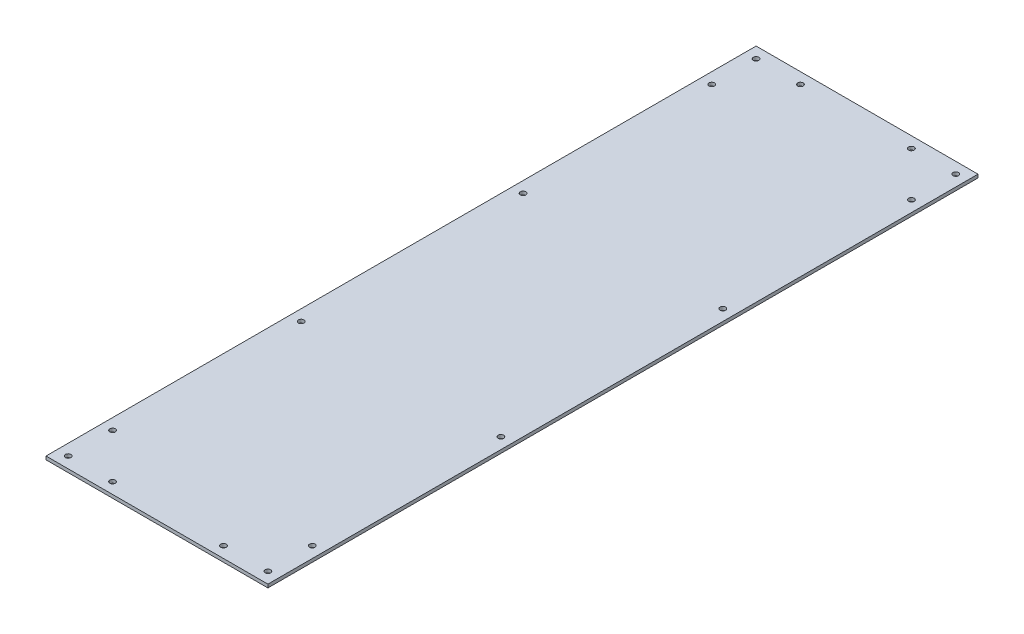
ISO-10303-21;
HEADER;
FILE_DESCRIPTION(('STEP AP214'),'2;1');
FILE_NAME('part.step','',(''),(''),'','','');
FILE_SCHEMA(('AUTOMOTIVE_DESIGN { 1 0 10303 214 1 1 1 1 }'));
ENDSEC;
DATA;
#1=APPLICATION_CONTEXT('core data for automotive mechanical design processes');
#2=APPLICATION_PROTOCOL_DEFINITION('international standard','automotive_design',2000,#1);
#3=PRODUCT_CONTEXT('',#1,'mechanical');
#4=PRODUCT('Part','Part','',(#3));
#5=PRODUCT_RELATED_PRODUCT_CATEGORY('part','',(#4));
#6=PRODUCT_DEFINITION_FORMATION('','',#4);
#7=PRODUCT_DEFINITION_CONTEXT('part definition',#1,'design');
#8=PRODUCT_DEFINITION('design','',#6,#7);
#9=PRODUCT_DEFINITION_SHAPE('','',#8);
#10=(LENGTH_UNIT() NAMED_UNIT(*) SI_UNIT(.MILLI.,.METRE.));
#11=(NAMED_UNIT(*) PLANE_ANGLE_UNIT() SI_UNIT($,.RADIAN.));
#12=(NAMED_UNIT(*) SI_UNIT($,.STERADIAN.) SOLID_ANGLE_UNIT());
#13=UNCERTAINTY_MEASURE_WITH_UNIT(LENGTH_MEASURE(1.E-05),#10,'distance_accuracy_value','');
#14=(GEOMETRIC_REPRESENTATION_CONTEXT(3) GLOBAL_UNCERTAINTY_ASSIGNED_CONTEXT((#13)) GLOBAL_UNIT_ASSIGNED_CONTEXT((#10,
#11,#12)) REPRESENTATION_CONTEXT('',''));
#15=CARTESIAN_POINT('',(0.,0.,0.));
#16=DIRECTION('',(0.,0.,1.));
#17=DIRECTION('',(1.,0.,0.));
#18=AXIS2_PLACEMENT_3D('',#15,#16,#17);
#19=CARTESIAN_POINT('',(0.,-3.,0.));
#20=DIRECTION('',(0.,-1.,0.));
#21=DIRECTION('',(1.,0.,0.));
#22=AXIS2_PLACEMENT_3D('',#19,#20,#21);
#23=PLANE('',#22);
#24=CARTESIAN_POINT('',(22.8925619834711,-3.,-549.00826446281));
#25=DIRECTION('',(0.,1.,0.));
#26=DIRECTION('',(0.,0.,-1.));
#27=AXIS2_PLACEMENT_3D('',#24,#25,#26);
#28=CIRCLE('',#27,2.5);
#29=CARTESIAN_POINT('',(22.8925619834711,-3.,-551.50826446281));
#30=VERTEX_POINT('',#29);
#31=EDGE_CURVE('E11',#30,#30,#28,.T.);
#32=ORIENTED_EDGE('',*,*,#31,.T.);
#33=EDGE_LOOP('',(#32));
#34=FACE_BOUND('',#33,.T.);
#35=CARTESIAN_POINT('',(122.892561983471,-3.,70.9917355371901));
#36=DIRECTION('',(0.,1.,0.));
#37=DIRECTION('',(0.,0.,-1.));
#38=AXIS2_PLACEMENT_3D('',#35,#36,#37);
#39=CIRCLE('',#38,2.5);
#40=CARTESIAN_POINT('',(122.892561983471,-3.,68.4917355371901));
#41=VERTEX_POINT('',#40);
#42=EDGE_CURVE('E24',#41,#41,#39,.T.);
#43=ORIENTED_EDGE('',*,*,#42,.T.);
#44=EDGE_LOOP('',(#43));
#45=FACE_BOUND('',#44,.T.);
#46=CARTESIAN_POINT('',(162.892561983471,-3.,30.9917355371901));
#47=DIRECTION('',(0.,1.,0.));
#48=DIRECTION('',(0.,0.,-1.));
#49=AXIS2_PLACEMENT_3D('',#46,#47,#48);
#50=CIRCLE('',#49,2.5);
#51=CARTESIAN_POINT('',(162.892561983471,-3.,28.4917355371901));
#52=VERTEX_POINT('',#51);
#53=EDGE_CURVE('E176',#52,#52,#50,.T.);
#54=ORIENTED_EDGE('',*,*,#53,.T.);
#55=EDGE_LOOP('',(#54));
#56=FACE_BOUND('',#55,.T.);
#57=CARTESIAN_POINT('',(-17.1074380165289,-3.,-509.00826446281));
#58=DIRECTION('',(0.,1.,0.));
#59=DIRECTION('',(0.,0.,-1.));
#60=AXIS2_PLACEMENT_3D('',#57,#58,#59);
#61=CIRCLE('',#60,2.5);
#62=CARTESIAN_POINT('',(-17.1074380165289,-3.,-511.50826446281));
#63=VERTEX_POINT('',#62);
#64=EDGE_CURVE('E173',#63,#63,#61,.T.);
#65=ORIENTED_EDGE('',*,*,#64,.T.);
#66=EDGE_LOOP('',(#65));
#67=FACE_BOUND('',#66,.T.);
#68=CARTESIAN_POINT('',(-17.1074380165289,-3.,70.9917355371901));
#69=DIRECTION('',(0.,-1.,0.));
#70=DIRECTION('',(1.,0.,0.));
#71=AXIS2_PLACEMENT_3D('',#68,#69,#70);
#72=CIRCLE('',#71,2.5);
#73=CARTESIAN_POINT('',(-14.6074380165289,-3.,70.9917355371901));
#74=VERTEX_POINT('',#73);
#75=EDGE_CURVE('E170',#74,#74,#72,.T.);
#76=ORIENTED_EDGE('',*,*,#75,.F.);
#77=EDGE_LOOP('',(#76));
#78=FACE_BOUND('',#77,.T.);
#79=CARTESIAN_POINT('',(-17.1074380165289,-3.,-339.00826446281));
#80=DIRECTION('',(0.,-1.,0.));
#81=DIRECTION('',(1.,0.,0.));
#82=AXIS2_PLACEMENT_3D('',#79,#80,#81);
#83=CIRCLE('',#82,2.5);
#84=CARTESIAN_POINT('',(-14.6074380165289,-3.,-339.00826446281));
#85=VERTEX_POINT('',#84);
#86=EDGE_CURVE('E167',#85,#85,#83,.T.);
#87=ORIENTED_EDGE('',*,*,#86,.F.);
#88=EDGE_LOOP('',(#87));
#89=FACE_BOUND('',#88,.T.);
#90=CARTESIAN_POINT('',(162.892561983471,-3.,70.9917355371902));
#91=DIRECTION('',(0.,-1.,0.));
#92=DIRECTION('',(1.,0.,0.));
#93=AXIS2_PLACEMENT_3D('',#90,#91,#92);
#94=CIRCLE('',#93,2.5);
#95=CARTESIAN_POINT('',(165.392561983471,-3.,70.9917355371902));
#96=VERTEX_POINT('',#95);
#97=EDGE_CURVE('E164',#96,#96,#94,.T.);
#98=ORIENTED_EDGE('',*,*,#97,.F.);
#99=EDGE_LOOP('',(#98));
#100=FACE_BOUND('',#99,.T.);
#101=CARTESIAN_POINT('',(-17.1074380165289,-3.,-549.00826446281));
#102=DIRECTION('',(0.,-1.,0.));
#103=DIRECTION('',(1.,0.,0.));
#104=AXIS2_PLACEMENT_3D('',#101,#102,#103);
#105=CIRCLE('',#104,2.5);
#106=CARTESIAN_POINT('',(-14.6074380165289,-3.,-549.00826446281));
#107=VERTEX_POINT('',#106);
#108=EDGE_CURVE('E161',#107,#107,#105,.T.);
#109=ORIENTED_EDGE('',*,*,#108,.F.);
#110=EDGE_LOOP('',(#109));
#111=FACE_BOUND('',#110,.T.);
#112=CARTESIAN_POINT('',(-17.1074380165289,-3.,-139.00826446281));
#113=DIRECTION('',(0.,-1.,0.));
#114=DIRECTION('',(1.,0.,0.));
#115=AXIS2_PLACEMENT_3D('',#112,#113,#114);
#116=CIRCLE('',#115,2.5);
#117=CARTESIAN_POINT('',(-14.6074380165289,-3.,-139.00826446281));
#118=VERTEX_POINT('',#117);
#119=EDGE_CURVE('E158',#118,#118,#116,.T.);
#120=ORIENTED_EDGE('',*,*,#119,.F.);
#121=EDGE_LOOP('',(#120));
#122=FACE_BOUND('',#121,.T.);
#123=CARTESIAN_POINT('',(162.892561983471,-3.,-139.00826446281));
#124=DIRECTION('',(0.,-1.,0.));
#125=DIRECTION('',(1.,0.,0.));
#126=AXIS2_PLACEMENT_3D('',#123,#124,#125);
#127=CIRCLE('',#126,2.5);
#128=CARTESIAN_POINT('',(165.392561983471,-3.,-139.00826446281));
#129=VERTEX_POINT('',#128);
#130=EDGE_CURVE('E155',#129,#129,#127,.T.);
#131=ORIENTED_EDGE('',*,*,#130,.F.);
#132=EDGE_LOOP('',(#131));
#133=FACE_BOUND('',#132,.T.);
#134=CARTESIAN_POINT('',(162.892561983471,-3.,-339.00826446281));
#135=DIRECTION('',(0.,-1.,0.));
#136=DIRECTION('',(1.,0.,0.));
#137=AXIS2_PLACEMENT_3D('',#134,#135,#136);
#138=CIRCLE('',#137,2.5);
#139=CARTESIAN_POINT('',(165.392561983471,-3.,-339.00826446281));
#140=VERTEX_POINT('',#139);
#141=EDGE_CURVE('E152',#140,#140,#138,.T.);
#142=ORIENTED_EDGE('',*,*,#141,.F.);
#143=EDGE_LOOP('',(#142));
#144=FACE_BOUND('',#143,.T.);
#145=CARTESIAN_POINT('',(162.892561983471,-3.,-549.00826446281));
#146=DIRECTION('',(0.,-1.,0.));
#147=DIRECTION('',(1.,0.,0.));
#148=AXIS2_PLACEMENT_3D('',#145,#146,#147);
#149=CIRCLE('',#148,2.5);
#150=CARTESIAN_POINT('',(165.392561983471,-3.,-549.00826446281));
#151=VERTEX_POINT('',#150);
#152=EDGE_CURVE('E149',#151,#151,#149,.T.);
#153=ORIENTED_EDGE('',*,*,#152,.F.);
#154=EDGE_LOOP('',(#153));
#155=FACE_BOUND('',#154,.T.);
#156=DIRECTION('',(0.,0.,-1.));
#157=VECTOR('',#156,1.);
#158=CARTESIAN_POINT('',(-27.1074380165289,-3.,80.9917355371901));
#159=LINE('',#158,#157);
#160=CARTESIAN_POINT('',(-27.1074380165289,-3.,80.9917355371901));
#161=VERTEX_POINT('',#160);
#162=CARTESIAN_POINT('',(-27.1074380165288,-3.,-559.00826446281));
#163=VERTEX_POINT('',#162);
#164=EDGE_CURVE('E31',#161,#163,#159,.T.);
#165=ORIENTED_EDGE('',*,*,#164,.T.);
#166=DIRECTION('',(1.,0.,0.));
#167=VECTOR('',#166,1.);
#168=CARTESIAN_POINT('',(-27.1074380165288,-3.,-559.00826446281));
#169=LINE('',#168,#167);
#170=CARTESIAN_POINT('',(172.892561983471,-3.,-559.00826446281));
#171=VERTEX_POINT('',#170);
#172=EDGE_CURVE('E36',#163,#171,#169,.T.);
#173=ORIENTED_EDGE('',*,*,#172,.T.);
#174=DIRECTION('',(0.,0.,1.));
#175=VECTOR('',#174,1.);
#176=CARTESIAN_POINT('',(172.892561983471,-3.,80.9917355371901));
#177=LINE('',#176,#175);
#178=CARTESIAN_POINT('',(172.892561983471,-3.,80.9917355371901));
#179=VERTEX_POINT('',#178);
#180=EDGE_CURVE('E145',#171,#179,#177,.T.);
#181=ORIENTED_EDGE('',*,*,#180,.T.);
#182=DIRECTION('',(-1.,0.,0.));
#183=VECTOR('',#182,1.);
#184=CARTESIAN_POINT('',(-27.1074380165289,-3.,80.9917355371901));
#185=LINE('',#184,#183);
#186=EDGE_CURVE('E143',#179,#161,#185,.T.);
#187=ORIENTED_EDGE('',*,*,#186,.T.);
#188=EDGE_LOOP('',(#165,#173,#181,#187));
#189=FACE_BOUND('',#188,.T.);
#190=CARTESIAN_POINT('',(22.8925619834711,-3.,70.9917355371901));
#191=DIRECTION('',(0.,-1.,0.));
#192=DIRECTION('',(0.,0.,-1.));
#193=AXIS2_PLACEMENT_3D('',#190,#191,#192);
#194=CIRCLE('',#193,2.5);
#195=CARTESIAN_POINT('',(22.8925619834711,-3.,68.4917355371901));
#196=VERTEX_POINT('',#195);
#197=EDGE_CURVE('E140',#196,#196,#194,.T.);
#198=ORIENTED_EDGE('',*,*,#197,.F.);
#199=EDGE_LOOP('',(#198));
#200=FACE_BOUND('',#199,.T.);
#201=CARTESIAN_POINT('',(162.892561983471,-3.,-509.00826446281));
#202=DIRECTION('',(0.,-1.,0.));
#203=DIRECTION('',(0.,0.,-1.));
#204=AXIS2_PLACEMENT_3D('',#201,#202,#203);
#205=CIRCLE('',#204,2.5);
#206=CARTESIAN_POINT('',(162.892561983471,-3.,-511.50826446281));
#207=VERTEX_POINT('',#206);
#208=EDGE_CURVE('E137',#207,#207,#205,.T.);
#209=ORIENTED_EDGE('',*,*,#208,.F.);
#210=EDGE_LOOP('',(#209));
#211=FACE_BOUND('',#210,.T.);
#212=CARTESIAN_POINT('',(122.892561983471,-3.,-549.00826446281));
#213=DIRECTION('',(0.,-1.,0.));
#214=DIRECTION('',(0.,0.,-1.));
#215=AXIS2_PLACEMENT_3D('',#212,#213,#214);
#216=CIRCLE('',#215,2.5);
#217=CARTESIAN_POINT('',(122.892561983471,-3.,-551.50826446281));
#218=VERTEX_POINT('',#217);
#219=EDGE_CURVE('E134',#218,#218,#216,.T.);
#220=ORIENTED_EDGE('',*,*,#219,.F.);
#221=EDGE_LOOP('',(#220));
#222=FACE_BOUND('',#221,.T.);
#223=CARTESIAN_POINT('',(-17.1074380165289,-3.,30.9917355371901));
#224=DIRECTION('',(0.,-1.,0.));
#225=DIRECTION('',(0.,0.,-1.));
#226=AXIS2_PLACEMENT_3D('',#223,#224,#225);
#227=CIRCLE('',#226,2.5);
#228=CARTESIAN_POINT('',(-17.1074380165289,-3.,28.4917355371901));
#229=VERTEX_POINT('',#228);
#230=EDGE_CURVE('E131',#229,#229,#227,.T.);
#231=ORIENTED_EDGE('',*,*,#230,.F.);
#232=EDGE_LOOP('',(#231));
#233=FACE_BOUND('',#232,.T.);
#234=ADVANCED_FACE('F17',(#34,#45,#56,#67,#78,#89,#100,#111,#122,#133,#144,#155,#189,#200,#211,
#222,#233),#23,.T.);
#235=CARTESIAN_POINT('',(0.,0.,0.));
#236=DIRECTION('',(0.,-1.,0.));
#237=DIRECTION('',(1.,0.,0.));
#238=AXIS2_PLACEMENT_3D('',#235,#236,#237);
#239=PLANE('',#238);
#240=CARTESIAN_POINT('',(122.892561983471,0.,-549.00826446281));
#241=DIRECTION('',(0.,-1.,0.));
#242=DIRECTION('',(0.,0.,-1.));
#243=AXIS2_PLACEMENT_3D('',#240,#241,#242);
#244=CIRCLE('',#243,2.5);
#245=CARTESIAN_POINT('',(122.892561983471,0.,-551.50826446281));
#246=VERTEX_POINT('',#245);
#247=EDGE_CURVE('E128',#246,#246,#244,.T.);
#248=ORIENTED_EDGE('',*,*,#247,.T.);
#249=EDGE_LOOP('',(#248));
#250=FACE_BOUND('',#249,.T.);
#251=CARTESIAN_POINT('',(22.8925619834711,0.,70.9917355371901));
#252=DIRECTION('',(0.,-1.,0.));
#253=DIRECTION('',(0.,0.,-1.));
#254=AXIS2_PLACEMENT_3D('',#251,#252,#253);
#255=CIRCLE('',#254,2.5);
#256=CARTESIAN_POINT('',(22.8925619834711,0.,68.4917355371901));
#257=VERTEX_POINT('',#256);
#258=EDGE_CURVE('E125',#257,#257,#255,.T.);
#259=ORIENTED_EDGE('',*,*,#258,.T.);
#260=EDGE_LOOP('',(#259));
#261=FACE_BOUND('',#260,.T.);
#262=CARTESIAN_POINT('',(122.892561983471,0.,70.9917355371901));
#263=DIRECTION('',(0.,-1.,0.));
#264=DIRECTION('',(0.,0.,-1.));
#265=AXIS2_PLACEMENT_3D('',#262,#263,#264);
#266=CIRCLE('',#265,2.5);
#267=CARTESIAN_POINT('',(122.892561983471,0.,68.4917355371901));
#268=VERTEX_POINT('',#267);
#269=EDGE_CURVE('E122',#268,#268,#266,.F.);
#270=ORIENTED_EDGE('',*,*,#269,.F.);
#271=EDGE_LOOP('',(#270));
#272=FACE_BOUND('',#271,.T.);
#273=CARTESIAN_POINT('',(162.892561983471,0.,30.9917355371901));
#274=DIRECTION('',(0.,-1.,0.));
#275=DIRECTION('',(0.,0.,-1.));
#276=AXIS2_PLACEMENT_3D('',#273,#274,#275);
#277=CIRCLE('',#276,2.5);
#278=CARTESIAN_POINT('',(162.892561983471,0.,28.4917355371901));
#279=VERTEX_POINT('',#278);
#280=EDGE_CURVE('E119',#279,#279,#277,.F.);
#281=ORIENTED_EDGE('',*,*,#280,.F.);
#282=EDGE_LOOP('',(#281));
#283=FACE_BOUND('',#282,.T.);
#284=CARTESIAN_POINT('',(-17.1074380165289,0.,-509.00826446281));
#285=DIRECTION('',(0.,-1.,0.));
#286=DIRECTION('',(0.,0.,-1.));
#287=AXIS2_PLACEMENT_3D('',#284,#285,#286);
#288=CIRCLE('',#287,2.5);
#289=CARTESIAN_POINT('',(-17.1074380165289,0.,-511.50826446281));
#290=VERTEX_POINT('',#289);
#291=EDGE_CURVE('E116',#290,#290,#288,.F.);
#292=ORIENTED_EDGE('',*,*,#291,.F.);
#293=EDGE_LOOP('',(#292));
#294=FACE_BOUND('',#293,.T.);
#295=CARTESIAN_POINT('',(-17.1074380165289,0.,70.9917355371901));
#296=DIRECTION('',(0.,-1.,0.));
#297=DIRECTION('',(1.,0.,0.));
#298=AXIS2_PLACEMENT_3D('',#295,#296,#297);
#299=CIRCLE('',#298,2.5);
#300=CARTESIAN_POINT('',(-14.6074380165289,0.,70.9917355371901));
#301=VERTEX_POINT('',#300);
#302=EDGE_CURVE('E113',#301,#301,#299,.T.);
#303=ORIENTED_EDGE('',*,*,#302,.T.);
#304=EDGE_LOOP('',(#303));
#305=FACE_BOUND('',#304,.T.);
#306=CARTESIAN_POINT('',(-17.1074380165289,0.,-339.00826446281));
#307=DIRECTION('',(0.,-1.,0.));
#308=DIRECTION('',(1.,0.,0.));
#309=AXIS2_PLACEMENT_3D('',#306,#307,#308);
#310=CIRCLE('',#309,2.5);
#311=CARTESIAN_POINT('',(-14.6074380165289,0.,-339.00826446281));
#312=VERTEX_POINT('',#311);
#313=EDGE_CURVE('E110',#312,#312,#310,.T.);
#314=ORIENTED_EDGE('',*,*,#313,.T.);
#315=EDGE_LOOP('',(#314));
#316=FACE_BOUND('',#315,.T.);
#317=CARTESIAN_POINT('',(162.892561983471,0.,70.9917355371902));
#318=DIRECTION('',(0.,-1.,0.));
#319=DIRECTION('',(1.,0.,0.));
#320=AXIS2_PLACEMENT_3D('',#317,#318,#319);
#321=CIRCLE('',#320,2.5);
#322=CARTESIAN_POINT('',(165.392561983471,0.,70.9917355371902));
#323=VERTEX_POINT('',#322);
#324=EDGE_CURVE('E107',#323,#323,#321,.T.);
#325=ORIENTED_EDGE('',*,*,#324,.T.);
#326=EDGE_LOOP('',(#325));
#327=FACE_BOUND('',#326,.T.);
#328=CARTESIAN_POINT('',(-17.1074380165289,0.,-549.00826446281));
#329=DIRECTION('',(0.,-1.,0.));
#330=DIRECTION('',(1.,0.,0.));
#331=AXIS2_PLACEMENT_3D('',#328,#329,#330);
#332=CIRCLE('',#331,2.5);
#333=CARTESIAN_POINT('',(-14.6074380165289,0.,-549.00826446281));
#334=VERTEX_POINT('',#333);
#335=EDGE_CURVE('E104',#334,#334,#332,.T.);
#336=ORIENTED_EDGE('',*,*,#335,.T.);
#337=EDGE_LOOP('',(#336));
#338=FACE_BOUND('',#337,.T.);
#339=CARTESIAN_POINT('',(-17.1074380165289,0.,-139.00826446281));
#340=DIRECTION('',(0.,-1.,0.));
#341=DIRECTION('',(1.,0.,0.));
#342=AXIS2_PLACEMENT_3D('',#339,#340,#341);
#343=CIRCLE('',#342,2.5);
#344=CARTESIAN_POINT('',(-14.6074380165289,0.,-139.00826446281));
#345=VERTEX_POINT('',#344);
#346=EDGE_CURVE('E101',#345,#345,#343,.T.);
#347=ORIENTED_EDGE('',*,*,#346,.T.);
#348=EDGE_LOOP('',(#347));
#349=FACE_BOUND('',#348,.T.);
#350=CARTESIAN_POINT('',(162.892561983471,0.,-139.00826446281));
#351=DIRECTION('',(0.,-1.,0.));
#352=DIRECTION('',(1.,0.,0.));
#353=AXIS2_PLACEMENT_3D('',#350,#351,#352);
#354=CIRCLE('',#353,2.5);
#355=CARTESIAN_POINT('',(165.392561983471,0.,-139.00826446281));
#356=VERTEX_POINT('',#355);
#357=EDGE_CURVE('E98',#356,#356,#354,.T.);
#358=ORIENTED_EDGE('',*,*,#357,.T.);
#359=EDGE_LOOP('',(#358));
#360=FACE_BOUND('',#359,.T.);
#361=CARTESIAN_POINT('',(162.892561983471,0.,-339.00826446281));
#362=DIRECTION('',(0.,-1.,0.));
#363=DIRECTION('',(1.,0.,0.));
#364=AXIS2_PLACEMENT_3D('',#361,#362,#363);
#365=CIRCLE('',#364,2.5);
#366=CARTESIAN_POINT('',(165.392561983471,0.,-339.00826446281));
#367=VERTEX_POINT('',#366);
#368=EDGE_CURVE('E95',#367,#367,#365,.T.);
#369=ORIENTED_EDGE('',*,*,#368,.T.);
#370=EDGE_LOOP('',(#369));
#371=FACE_BOUND('',#370,.T.);
#372=CARTESIAN_POINT('',(162.892561983471,0.,-549.00826446281));
#373=DIRECTION('',(0.,-1.,0.));
#374=DIRECTION('',(1.,0.,0.));
#375=AXIS2_PLACEMENT_3D('',#372,#373,#374);
#376=CIRCLE('',#375,2.5);
#377=CARTESIAN_POINT('',(165.392561983471,0.,-549.00826446281));
#378=VERTEX_POINT('',#377);
#379=EDGE_CURVE('E74',#378,#378,#376,.T.);
#380=ORIENTED_EDGE('',*,*,#379,.T.);
#381=EDGE_LOOP('',(#380));
#382=FACE_BOUND('',#381,.T.);
#383=DIRECTION('',(0.,0.,-1.));
#384=VECTOR('',#383,1.);
#385=CARTESIAN_POINT('',(-27.1074380165289,0.,80.9917355371901));
#386=LINE('',#385,#384);
#387=CARTESIAN_POINT('',(-27.1074380165289,0.,80.9917355371901));
#388=VERTEX_POINT('',#387);
#389=CARTESIAN_POINT('',(-27.1074380165288,0.,-559.00826446281));
#390=VERTEX_POINT('',#389);
#391=EDGE_CURVE('E59',#388,#390,#386,.T.);
#392=ORIENTED_EDGE('',*,*,#391,.F.);
#393=DIRECTION('',(-1.,0.,0.));
#394=VECTOR('',#393,1.);
#395=CARTESIAN_POINT('',(-27.1074380165289,0.,80.9917355371901));
#396=LINE('',#395,#394);
#397=CARTESIAN_POINT('',(172.892561983471,0.,80.9917355371901));
#398=VERTEX_POINT('',#397);
#399=EDGE_CURVE('E75',#398,#388,#396,.T.);
#400=ORIENTED_EDGE('',*,*,#399,.F.);
#401=DIRECTION('',(0.,0.,1.));
#402=VECTOR('',#401,1.);
#403=CARTESIAN_POINT('',(172.892561983471,0.,80.9917355371901));
#404=LINE('',#403,#402);
#405=CARTESIAN_POINT('',(172.892561983471,0.,-559.00826446281));
#406=VERTEX_POINT('',#405);
#407=EDGE_CURVE('E62',#406,#398,#404,.T.);
#408=ORIENTED_EDGE('',*,*,#407,.F.);
#409=DIRECTION('',(1.,0.,0.));
#410=VECTOR('',#409,1.);
#411=CARTESIAN_POINT('',(-27.1074380165288,0.,-559.00826446281));
#412=LINE('',#411,#410);
#413=EDGE_CURVE('E55',#390,#406,#412,.T.);
#414=ORIENTED_EDGE('',*,*,#413,.F.);
#415=EDGE_LOOP('',(#392,#400,#408,#414));
#416=FACE_BOUND('',#415,.T.);
#417=CARTESIAN_POINT('',(22.8925619834711,0.,-549.00826446281));
#418=DIRECTION('',(0.,-1.,0.));
#419=DIRECTION('',(0.,0.,-1.));
#420=AXIS2_PLACEMENT_3D('',#417,#418,#419);
#421=CIRCLE('',#420,2.5);
#422=CARTESIAN_POINT('',(22.8925619834711,0.,-551.50826446281));
#423=VERTEX_POINT('',#422);
#424=EDGE_CURVE('E66',#423,#423,#421,.F.);
#425=ORIENTED_EDGE('',*,*,#424,.F.);
#426=EDGE_LOOP('',(#425));
#427=FACE_BOUND('',#426,.T.);
#428=CARTESIAN_POINT('',(162.892561983471,0.,-509.00826446281));
#429=DIRECTION('',(0.,-1.,0.));
#430=DIRECTION('',(0.,0.,-1.));
#431=AXIS2_PLACEMENT_3D('',#428,#429,#430);
#432=CIRCLE('',#431,2.5);
#433=CARTESIAN_POINT('',(162.892561983471,0.,-511.50826446281));
#434=VERTEX_POINT('',#433);
#435=EDGE_CURVE('E81',#434,#434,#432,.T.);
#436=ORIENTED_EDGE('',*,*,#435,.T.);
#437=EDGE_LOOP('',(#436));
#438=FACE_BOUND('',#437,.T.);
#439=CARTESIAN_POINT('',(-17.1074380165289,0.,30.9917355371901));
#440=DIRECTION('',(0.,-1.,0.));
#441=DIRECTION('',(0.,0.,-1.));
#442=AXIS2_PLACEMENT_3D('',#439,#440,#441);
#443=CIRCLE('',#442,2.5);
#444=CARTESIAN_POINT('',(-17.1074380165289,0.,28.4917355371901));
#445=VERTEX_POINT('',#444);
#446=EDGE_CURVE('E78',#445,#445,#443,.T.);
#447=ORIENTED_EDGE('',*,*,#446,.T.);
#448=EDGE_LOOP('',(#447));
#449=FACE_BOUND('',#448,.T.);
#450=ADVANCED_FACE('F57',(#250,#261,#272,#283,#294,#305,#316,#327,#338,#349,#360,#371,#382,#416,
#427,#438,#449),#239,.F.);
#451=CARTESIAN_POINT('',(-27.1074380165289,-3.,80.9917355371901));
#452=DIRECTION('',(1.,0.,0.));
#453=DIRECTION('',(0.,0.,1.));
#454=AXIS2_PLACEMENT_3D('',#451,#452,#453);
#455=PLANE('',#454);
#456=ORIENTED_EDGE('',*,*,#391,.T.);
#457=DIRECTION('',(0.,1.,0.));
#458=VECTOR('',#457,1.);
#459=CARTESIAN_POINT('',(-27.1074380165288,-3.,-559.00826446281));
#460=LINE('',#459,#458);
#461=EDGE_CURVE('E70',#163,#390,#460,.T.);
#462=ORIENTED_EDGE('',*,*,#461,.F.);
#463=ORIENTED_EDGE('',*,*,#164,.F.);
#464=DIRECTION('',(0.,1.,0.));
#465=VECTOR('',#464,1.);
#466=CARTESIAN_POINT('',(-27.1074380165289,-3.,80.9917355371901));
#467=LINE('',#466,#465);
#468=EDGE_CURVE('E72',#161,#388,#467,.T.);
#469=ORIENTED_EDGE('',*,*,#468,.T.);
#470=EDGE_LOOP('',(#456,#462,#463,#469));
#471=FACE_BOUND('',#470,.T.);
#472=ADVANCED_FACE('F69',(#471),#455,.F.);
#473=CARTESIAN_POINT('',(-27.1074380165288,-3.,-559.00826446281));
#474=DIRECTION('',(0.,0.,1.));
#475=DIRECTION('',(0.,-1.,0.));
#476=AXIS2_PLACEMENT_3D('',#473,#474,#475);
#477=PLANE('',#476);
#478=ORIENTED_EDGE('',*,*,#413,.T.);
#479=DIRECTION('',(0.,1.,0.));
#480=VECTOR('',#479,1.);
#481=CARTESIAN_POINT('',(172.892561983471,-3.,-559.00826446281));
#482=LINE('',#481,#480);
#483=EDGE_CURVE('E83',#171,#406,#482,.T.);
#484=ORIENTED_EDGE('',*,*,#483,.F.);
#485=ORIENTED_EDGE('',*,*,#172,.F.);
#486=ORIENTED_EDGE('',*,*,#461,.T.);
#487=EDGE_LOOP('',(#478,#484,#485,#486));
#488=FACE_BOUND('',#487,.T.);
#489=ADVANCED_FACE('F77',(#488),#477,.F.);
#490=CARTESIAN_POINT('',(172.892561983471,-3.,80.9917355371901));
#491=DIRECTION('',(-1.,0.,0.));
#492=DIRECTION('',(0.,0.,-1.));
#493=AXIS2_PLACEMENT_3D('',#490,#491,#492);
#494=PLANE('',#493);
#495=ORIENTED_EDGE('',*,*,#407,.T.);
#496=DIRECTION('',(0.,1.,0.));
#497=VECTOR('',#496,1.);
#498=CARTESIAN_POINT('',(172.892561983471,-3.,80.9917355371901));
#499=LINE('',#498,#497);
#500=EDGE_CURVE('E446',#179,#398,#499,.T.);
#501=ORIENTED_EDGE('',*,*,#500,.F.);
#502=ORIENTED_EDGE('',*,*,#180,.F.);
#503=ORIENTED_EDGE('',*,*,#483,.T.);
#504=EDGE_LOOP('',(#495,#501,#502,#503));
#505=FACE_BOUND('',#504,.T.);
#506=ADVANCED_FACE('F294',(#505),#494,.F.);
#507=CARTESIAN_POINT('',(-27.1074380165289,-3.,80.9917355371901));
#508=DIRECTION('',(0.,0.,-1.));
#509=DIRECTION('',(0.,1.,0.));
#510=AXIS2_PLACEMENT_3D('',#507,#508,#509);
#511=PLANE('',#510);
#512=ORIENTED_EDGE('',*,*,#399,.T.);
#513=ORIENTED_EDGE('',*,*,#468,.F.);
#514=ORIENTED_EDGE('',*,*,#186,.F.);
#515=ORIENTED_EDGE('',*,*,#500,.T.);
#516=EDGE_LOOP('',(#512,#513,#514,#515));
#517=FACE_BOUND('',#516,.T.);
#518=ADVANCED_FACE('F218',(#517),#511,.F.);
#519=CARTESIAN_POINT('',(162.892561983471,0.,-549.00826446281));
#520=DIRECTION('',(0.,-1.,0.));
#521=DIRECTION('',(1.,0.,0.));
#522=AXIS2_PLACEMENT_3D('',#519,#520,#521);
#523=CYLINDRICAL_SURFACE('',#522,2.5);
#524=ORIENTED_EDGE('',*,*,#379,.F.);
#525=EDGE_LOOP('',(#524));
#526=FACE_BOUND('',#525,.T.);
#527=ORIENTED_EDGE('',*,*,#152,.T.);
#528=EDGE_LOOP('',(#527));
#529=FACE_BOUND('',#528,.T.);
#530=ADVANCED_FACE('F214',(#526,#529),#523,.F.);
#531=CARTESIAN_POINT('',(162.892561983471,0.,-339.00826446281));
#532=DIRECTION('',(0.,-1.,0.));
#533=DIRECTION('',(1.,0.,0.));
#534=AXIS2_PLACEMENT_3D('',#531,#532,#533);
#535=CYLINDRICAL_SURFACE('',#534,2.5);
#536=ORIENTED_EDGE('',*,*,#368,.F.);
#537=EDGE_LOOP('',(#536));
#538=FACE_BOUND('',#537,.T.);
#539=ORIENTED_EDGE('',*,*,#141,.T.);
#540=EDGE_LOOP('',(#539));
#541=FACE_BOUND('',#540,.T.);
#542=ADVANCED_FACE('F217',(#538,#541),#535,.F.);
#543=CARTESIAN_POINT('',(162.892561983471,0.,-139.00826446281));
#544=DIRECTION('',(0.,-1.,0.));
#545=DIRECTION('',(1.,0.,0.));
#546=AXIS2_PLACEMENT_3D('',#543,#544,#545);
#547=CYLINDRICAL_SURFACE('',#546,2.5);
#548=ORIENTED_EDGE('',*,*,#357,.F.);
#549=EDGE_LOOP('',(#548));
#550=FACE_BOUND('',#549,.T.);
#551=ORIENTED_EDGE('',*,*,#130,.T.);
#552=EDGE_LOOP('',(#551));
#553=FACE_BOUND('',#552,.T.);
#554=ADVANCED_FACE('F284',(#550,#553),#547,.F.);
#555=CARTESIAN_POINT('',(-17.1074380165289,0.,-139.00826446281));
#556=DIRECTION('',(0.,-1.,0.));
#557=DIRECTION('',(1.,0.,0.));
#558=AXIS2_PLACEMENT_3D('',#555,#556,#557);
#559=CYLINDRICAL_SURFACE('',#558,2.5);
#560=ORIENTED_EDGE('',*,*,#346,.F.);
#561=EDGE_LOOP('',(#560));
#562=FACE_BOUND('',#561,.T.);
#563=ORIENTED_EDGE('',*,*,#119,.T.);
#564=EDGE_LOOP('',(#563));
#565=FACE_BOUND('',#564,.T.);
#566=ADVANCED_FACE('F280',(#562,#565),#559,.F.);
#567=CARTESIAN_POINT('',(-17.1074380165289,0.,-549.00826446281));
#568=DIRECTION('',(0.,-1.,0.));
#569=DIRECTION('',(1.,0.,0.));
#570=AXIS2_PLACEMENT_3D('',#567,#568,#569);
#571=CYLINDRICAL_SURFACE('',#570,2.5);
#572=ORIENTED_EDGE('',*,*,#335,.F.);
#573=EDGE_LOOP('',(#572));
#574=FACE_BOUND('',#573,.T.);
#575=ORIENTED_EDGE('',*,*,#108,.T.);
#576=EDGE_LOOP('',(#575));
#577=FACE_BOUND('',#576,.T.);
#578=ADVANCED_FACE('F276',(#574,#577),#571,.F.);
#579=CARTESIAN_POINT('',(162.892561983471,0.,70.9917355371902));
#580=DIRECTION('',(0.,-1.,0.));
#581=DIRECTION('',(1.,0.,0.));
#582=AXIS2_PLACEMENT_3D('',#579,#580,#581);
#583=CYLINDRICAL_SURFACE('',#582,2.5);
#584=ORIENTED_EDGE('',*,*,#324,.F.);
#585=EDGE_LOOP('',(#584));
#586=FACE_BOUND('',#585,.T.);
#587=ORIENTED_EDGE('',*,*,#97,.T.);
#588=EDGE_LOOP('',(#587));
#589=FACE_BOUND('',#588,.T.);
#590=ADVANCED_FACE('F272',(#586,#589),#583,.F.);
#591=CARTESIAN_POINT('',(-17.1074380165289,0.,-339.00826446281));
#592=DIRECTION('',(0.,-1.,0.));
#593=DIRECTION('',(1.,0.,0.));
#594=AXIS2_PLACEMENT_3D('',#591,#592,#593);
#595=CYLINDRICAL_SURFACE('',#594,2.5);
#596=ORIENTED_EDGE('',*,*,#313,.F.);
#597=EDGE_LOOP('',(#596));
#598=FACE_BOUND('',#597,.T.);
#599=ORIENTED_EDGE('',*,*,#86,.T.);
#600=EDGE_LOOP('',(#599));
#601=FACE_BOUND('',#600,.T.);
#602=ADVANCED_FACE('F268',(#598,#601),#595,.F.);
#603=CARTESIAN_POINT('',(-17.1074380165289,0.,70.9917355371901));
#604=DIRECTION('',(0.,-1.,0.));
#605=DIRECTION('',(1.,0.,0.));
#606=AXIS2_PLACEMENT_3D('',#603,#604,#605);
#607=CYLINDRICAL_SURFACE('',#606,2.5);
#608=ORIENTED_EDGE('',*,*,#302,.F.);
#609=EDGE_LOOP('',(#608));
#610=FACE_BOUND('',#609,.T.);
#611=ORIENTED_EDGE('',*,*,#75,.T.);
#612=EDGE_LOOP('',(#611));
#613=FACE_BOUND('',#612,.T.);
#614=ADVANCED_FACE('F264',(#610,#613),#607,.F.);
#615=CARTESIAN_POINT('',(-17.1074380165289,22.,-509.00826446281));
#616=DIRECTION('',(0.,-1.,0.));
#617=DIRECTION('',(0.,0.,-1.));
#618=AXIS2_PLACEMENT_3D('',#615,#616,#617);
#619=CYLINDRICAL_SURFACE('',#618,2.5);
#620=ORIENTED_EDGE('',*,*,#64,.F.);
#621=EDGE_LOOP('',(#620));
#622=FACE_BOUND('',#621,.T.);
#623=ORIENTED_EDGE('',*,*,#291,.T.);
#624=EDGE_LOOP('',(#623));
#625=FACE_BOUND('',#624,.T.);
#626=ADVANCED_FACE('F260',(#622,#625),#619,.F.);
#627=CARTESIAN_POINT('',(162.892561983471,22.,30.9917355371901));
#628=DIRECTION('',(0.,-1.,0.));
#629=DIRECTION('',(0.,0.,-1.));
#630=AXIS2_PLACEMENT_3D('',#627,#628,#629);
#631=CYLINDRICAL_SURFACE('',#630,2.5);
#632=ORIENTED_EDGE('',*,*,#53,.F.);
#633=EDGE_LOOP('',(#632));
#634=FACE_BOUND('',#633,.T.);
#635=ORIENTED_EDGE('',*,*,#280,.T.);
#636=EDGE_LOOP('',(#635));
#637=FACE_BOUND('',#636,.T.);
#638=ADVANCED_FACE('F187',(#634,#637),#631,.F.);
#639=CARTESIAN_POINT('',(122.892561983471,22.,70.9917355371901));
#640=DIRECTION('',(0.,-1.,0.));
#641=DIRECTION('',(0.,0.,-1.));
#642=AXIS2_PLACEMENT_3D('',#639,#640,#641);
#643=CYLINDRICAL_SURFACE('',#642,2.5);
#644=ORIENTED_EDGE('',*,*,#42,.F.);
#645=EDGE_LOOP('',(#644));
#646=FACE_BOUND('',#645,.T.);
#647=ORIENTED_EDGE('',*,*,#269,.T.);
#648=EDGE_LOOP('',(#647));
#649=FACE_BOUND('',#648,.T.);
#650=ADVANCED_FACE('F183',(#646,#649),#643,.F.);
#651=CARTESIAN_POINT('',(22.8925619834711,22.,70.9917355371901));
#652=DIRECTION('',(0.,-1.,0.));
#653=DIRECTION('',(0.,0.,-1.));
#654=AXIS2_PLACEMENT_3D('',#651,#652,#653);
#655=CYLINDRICAL_SURFACE('',#654,2.5);
#656=ORIENTED_EDGE('',*,*,#197,.T.);
#657=EDGE_LOOP('',(#656));
#658=FACE_BOUND('',#657,.T.);
#659=ORIENTED_EDGE('',*,*,#258,.F.);
#660=EDGE_LOOP('',(#659));
#661=FACE_BOUND('',#660,.T.);
#662=ADVANCED_FACE('F186',(#658,#661),#655,.F.);
#663=CARTESIAN_POINT('',(22.8925619834711,22.,-549.00826446281));
#664=DIRECTION('',(0.,-1.,0.));
#665=DIRECTION('',(0.,0.,-1.));
#666=AXIS2_PLACEMENT_3D('',#663,#664,#665);
#667=CYLINDRICAL_SURFACE('',#666,2.5);
#668=ORIENTED_EDGE('',*,*,#31,.F.);
#669=EDGE_LOOP('',(#668));
#670=FACE_BOUND('',#669,.T.);
#671=ORIENTED_EDGE('',*,*,#424,.T.);
#672=EDGE_LOOP('',(#671));
#673=FACE_BOUND('',#672,.T.);
#674=ADVANCED_FACE('F250',(#670,#673),#667,.F.);
#675=CARTESIAN_POINT('',(162.892561983471,22.,-509.00826446281));
#676=DIRECTION('',(0.,-1.,0.));
#677=DIRECTION('',(0.,0.,-1.));
#678=AXIS2_PLACEMENT_3D('',#675,#676,#677);
#679=CYLINDRICAL_SURFACE('',#678,2.5);
#680=ORIENTED_EDGE('',*,*,#208,.T.);
#681=EDGE_LOOP('',(#680));
#682=FACE_BOUND('',#681,.T.);
#683=ORIENTED_EDGE('',*,*,#435,.F.);
#684=EDGE_LOOP('',(#683));
#685=FACE_BOUND('',#684,.T.);
#686=ADVANCED_FACE('F244',(#682,#685),#679,.F.);
#687=CARTESIAN_POINT('',(122.892561983471,22.,-549.00826446281));
#688=DIRECTION('',(0.,-1.,0.));
#689=DIRECTION('',(0.,0.,-1.));
#690=AXIS2_PLACEMENT_3D('',#687,#688,#689);
#691=CYLINDRICAL_SURFACE('',#690,2.5);
#692=ORIENTED_EDGE('',*,*,#219,.T.);
#693=EDGE_LOOP('',(#692));
#694=FACE_BOUND('',#693,.T.);
#695=ORIENTED_EDGE('',*,*,#247,.F.);
#696=EDGE_LOOP('',(#695));
#697=FACE_BOUND('',#696,.T.);
#698=ADVANCED_FACE('F236',(#694,#697),#691,.F.);
#699=CARTESIAN_POINT('',(-17.1074380165289,22.,30.9917355371901));
#700=DIRECTION('',(0.,-1.,0.));
#701=DIRECTION('',(0.,0.,-1.));
#702=AXIS2_PLACEMENT_3D('',#699,#700,#701);
#703=CYLINDRICAL_SURFACE('',#702,2.5);
#704=ORIENTED_EDGE('',*,*,#230,.T.);
#705=EDGE_LOOP('',(#704));
#706=FACE_BOUND('',#705,.T.);
#707=ORIENTED_EDGE('',*,*,#446,.F.);
#708=EDGE_LOOP('',(#707));
#709=FACE_BOUND('',#708,.T.);
#710=ADVANCED_FACE('F233',(#706,#709),#703,.F.);
#711=CLOSED_SHELL('',(#234,#450,#472,#489,#506,#518,#530,#542,#554,#566,#578,#590,#602,#614,
#626,#638,#650,#662,#674,#686,#698,#710));
#712=MANIFOLD_SOLID_BREP('B1',#711);
#713=ADVANCED_BREP_SHAPE_REPRESENTATION('',(#18,#712),#14);
#714=SHAPE_DEFINITION_REPRESENTATION(#9,#713);
ENDSEC;
END-ISO-10303-21;
